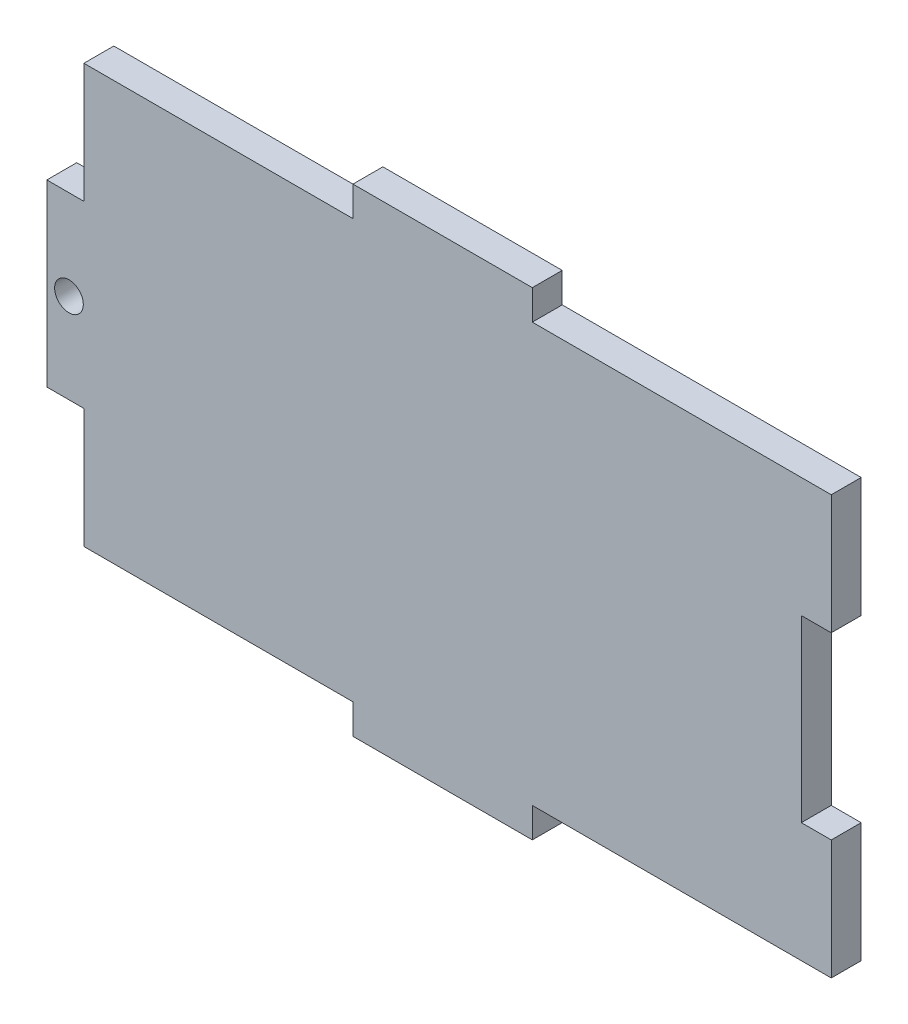
ISO-10303-21;
HEADER;
FILE_DESCRIPTION(('STEP AP214'),'2;1');
FILE_NAME('part.step','',(''),(''),'','','');
FILE_SCHEMA(('AUTOMOTIVE_DESIGN { 1 0 10303 214 1 1 1 1 }'));
ENDSEC;
DATA;
#1=APPLICATION_CONTEXT('core data for automotive mechanical design processes');
#2=APPLICATION_PROTOCOL_DEFINITION('international standard','automotive_design',2000,#1);
#3=PRODUCT_CONTEXT('',#1,'mechanical');
#4=PRODUCT('Part','Part','',(#3));
#5=PRODUCT_RELATED_PRODUCT_CATEGORY('part','',(#4));
#6=PRODUCT_DEFINITION_FORMATION('','',#4);
#7=PRODUCT_DEFINITION_CONTEXT('part definition',#1,'design');
#8=PRODUCT_DEFINITION('design','',#6,#7);
#9=PRODUCT_DEFINITION_SHAPE('','',#8);
#10=(LENGTH_UNIT() NAMED_UNIT(*) SI_UNIT(.MILLI.,.METRE.));
#11=(NAMED_UNIT(*) PLANE_ANGLE_UNIT() SI_UNIT($,.RADIAN.));
#12=(NAMED_UNIT(*) SI_UNIT($,.STERADIAN.) SOLID_ANGLE_UNIT());
#13=UNCERTAINTY_MEASURE_WITH_UNIT(LENGTH_MEASURE(1.E-05),#10,'distance_accuracy_value','');
#14=(GEOMETRIC_REPRESENTATION_CONTEXT(3) GLOBAL_UNCERTAINTY_ASSIGNED_CONTEXT((#13)) GLOBAL_UNIT_ASSIGNED_CONTEXT((#10,
#11,#12)) REPRESENTATION_CONTEXT('',''));
#15=CARTESIAN_POINT('',(0.,0.,0.));
#16=DIRECTION('',(0.,0.,1.));
#17=DIRECTION('',(1.,0.,0.));
#18=AXIS2_PLACEMENT_3D('',#15,#16,#17);
#19=CARTESIAN_POINT('',(79.375,0.,3.175));
#20=DIRECTION('',(-1.,0.,0.));
#21=DIRECTION('',(0.,-1.,0.));
#22=AXIS2_PLACEMENT_3D('',#19,#20,#21);
#23=PLANE('',#22);
#24=DIRECTION('',(0.,1.,0.));
#25=VECTOR('',#24,1.);
#26=CARTESIAN_POINT('',(79.375,0.,0.));
#27=LINE('',#26,#25);
#28=CARTESIAN_POINT('',(79.375,0.,0.));
#29=VERTEX_POINT('',#28);
#30=CARTESIAN_POINT('',(79.375,12.7,0.));
#31=VERTEX_POINT('',#30);
#32=EDGE_CURVE('E317',#29,#31,#27,.T.);
#33=ORIENTED_EDGE('',*,*,#32,.T.);
#34=DIRECTION('',(0.,0.,1.));
#35=VECTOR('',#34,1.);
#36=CARTESIAN_POINT('',(79.375,12.7,0.));
#37=LINE('',#36,#35);
#38=CARTESIAN_POINT('',(79.375,12.7,3.175));
#39=VERTEX_POINT('',#38);
#40=EDGE_CURVE('E220',#31,#39,#37,.T.);
#41=ORIENTED_EDGE('',*,*,#40,.T.);
#42=DIRECTION('',(0.,1.,0.));
#43=VECTOR('',#42,1.);
#44=CARTESIAN_POINT('',(79.375,0.,3.175));
#45=LINE('',#44,#43);
#46=CARTESIAN_POINT('',(79.375,0.,3.175));
#47=VERTEX_POINT('',#46);
#48=EDGE_CURVE('E379',#47,#39,#45,.T.);
#49=ORIENTED_EDGE('',*,*,#48,.F.);
#50=DIRECTION('',(0.,0.,-1.));
#51=VECTOR('',#50,1.);
#52=CARTESIAN_POINT('',(79.375,0.,3.175));
#53=LINE('',#52,#51);
#54=EDGE_CURVE('E42',#47,#29,#53,.T.);
#55=ORIENTED_EDGE('',*,*,#54,.T.);
#56=EDGE_LOOP('',(#33,#41,#49,#55));
#57=FACE_BOUND('',#56,.T.);
#58=ADVANCED_FACE('F33',(#57),#23,.F.);
#59=CARTESIAN_POINT('',(0.,0.,3.175));
#60=DIRECTION('',(0.,1.,0.));
#61=DIRECTION('',(0.,0.,1.));
#62=AXIS2_PLACEMENT_3D('',#59,#60,#61);
#63=PLANE('',#62);
#64=DIRECTION('',(0.,0.,1.));
#65=VECTOR('',#64,1.);
#66=CARTESIAN_POINT('',(47.625,0.,0.));
#67=LINE('',#66,#65);
#68=CARTESIAN_POINT('',(47.625,0.,0.));
#69=VERTEX_POINT('',#68);
#70=CARTESIAN_POINT('',(47.625,0.,3.175));
#71=VERTEX_POINT('',#70);
#72=EDGE_CURVE('E242',#69,#71,#67,.T.);
#73=ORIENTED_EDGE('',*,*,#72,.F.);
#74=DIRECTION('',(1.,0.,0.));
#75=VECTOR('',#74,1.);
#76=CARTESIAN_POINT('',(0.,0.,0.));
#77=LINE('',#76,#75);
#78=EDGE_CURVE('E310',#69,#29,#77,.T.);
#79=ORIENTED_EDGE('',*,*,#78,.T.);
#80=ORIENTED_EDGE('',*,*,#54,.F.);
#81=DIRECTION('',(1.,0.,0.));
#82=VECTOR('',#81,1.);
#83=CARTESIAN_POINT('',(0.,0.,3.175));
#84=LINE('',#83,#82);
#85=EDGE_CURVE('E360',#71,#47,#84,.T.);
#86=ORIENTED_EDGE('',*,*,#85,.F.);
#87=EDGE_LOOP('',(#73,#79,#80,#86));
#88=FACE_BOUND('',#87,.T.);
#89=ADVANCED_FACE('F398',(#88),#63,.F.);
#90=CARTESIAN_POINT('',(0.,44.45,3.175));
#91=DIRECTION('',(0.,-1.,0.));
#92=DIRECTION('',(0.,0.,-1.));
#93=AXIS2_PLACEMENT_3D('',#90,#91,#92);
#94=PLANE('',#93);
#95=DIRECTION('',(0.,0.,1.));
#96=VECTOR('',#95,1.);
#97=CARTESIAN_POINT('',(28.575,44.45,0.));
#98=LINE('',#97,#96);
#99=CARTESIAN_POINT('',(28.575,44.45,0.));
#100=VERTEX_POINT('',#99);
#101=CARTESIAN_POINT('',(28.575,44.45,3.175));
#102=VERTEX_POINT('',#101);
#103=EDGE_CURVE('E270',#100,#102,#98,.T.);
#104=ORIENTED_EDGE('',*,*,#103,.F.);
#105=DIRECTION('',(-1.,0.,0.));
#106=VECTOR('',#105,1.);
#107=CARTESIAN_POINT('',(0.,44.45,0.));
#108=LINE('',#107,#106);
#109=CARTESIAN_POINT('',(0.,44.45,0.));
#110=VERTEX_POINT('',#109);
#111=EDGE_CURVE('E321',#100,#110,#108,.T.);
#112=ORIENTED_EDGE('',*,*,#111,.T.);
#113=DIRECTION('',(0.,0.,-1.));
#114=VECTOR('',#113,1.);
#115=CARTESIAN_POINT('',(0.,44.45,3.175));
#116=LINE('',#115,#114);
#117=CARTESIAN_POINT('',(0.,44.45,3.175));
#118=VERTEX_POINT('',#117);
#119=EDGE_CURVE('E324',#118,#110,#116,.T.);
#120=ORIENTED_EDGE('',*,*,#119,.F.);
#121=DIRECTION('',(-1.,0.,0.));
#122=VECTOR('',#121,1.);
#123=CARTESIAN_POINT('',(0.,44.45,3.175));
#124=LINE('',#123,#122);
#125=EDGE_CURVE('E377',#102,#118,#124,.T.);
#126=ORIENTED_EDGE('',*,*,#125,.F.);
#127=EDGE_LOOP('',(#104,#112,#120,#126));
#128=FACE_BOUND('',#127,.T.);
#129=ADVANCED_FACE('F429',(#128),#94,.F.);
#130=CARTESIAN_POINT('',(0.,0.,3.175));
#131=DIRECTION('',(1.,0.,0.));
#132=DIRECTION('',(0.,1.,0.));
#133=AXIS2_PLACEMENT_3D('',#130,#131,#132);
#134=PLANE('',#133);
#135=DIRECTION('',(0.,0.,1.));
#136=VECTOR('',#135,1.);
#137=CARTESIAN_POINT('',(0.,12.7,0.));
#138=LINE('',#137,#136);
#139=CARTESIAN_POINT('',(0.,12.7,0.));
#140=VERTEX_POINT('',#139);
#141=CARTESIAN_POINT('',(0.,12.7,3.175));
#142=VERTEX_POINT('',#141);
#143=EDGE_CURVE('E341',#140,#142,#138,.T.);
#144=ORIENTED_EDGE('',*,*,#143,.F.);
#145=DIRECTION('',(0.,-1.,0.));
#146=VECTOR('',#145,1.);
#147=CARTESIAN_POINT('',(0.,0.,0.));
#148=LINE('',#147,#146);
#149=CARTESIAN_POINT('',(0.,0.,0.));
#150=VERTEX_POINT('',#149);
#151=EDGE_CURVE('E343',#140,#150,#148,.T.);
#152=ORIENTED_EDGE('',*,*,#151,.T.);
#153=DIRECTION('',(0.,0.,-1.));
#154=VECTOR('',#153,1.);
#155=CARTESIAN_POINT('',(0.,0.,3.175));
#156=LINE('',#155,#154);
#157=CARTESIAN_POINT('',(0.,0.,3.175));
#158=VERTEX_POINT('',#157);
#159=EDGE_CURVE('E11',#158,#150,#156,.T.);
#160=ORIENTED_EDGE('',*,*,#159,.F.);
#161=DIRECTION('',(0.,-1.,0.));
#162=VECTOR('',#161,1.);
#163=CARTESIAN_POINT('',(0.,0.,3.175));
#164=LINE('',#163,#162);
#165=EDGE_CURVE('E333',#142,#158,#164,.T.);
#166=ORIENTED_EDGE('',*,*,#165,.F.);
#167=EDGE_LOOP('',(#144,#152,#160,#166));
#168=FACE_BOUND('',#167,.T.);
#169=ADVANCED_FACE('F442',(#168),#134,.F.);
#170=CARTESIAN_POINT('',(0.,31.75,0.));
#171=VERTEX_POINT('',#170);
#172=EDGE_CURVE('E362',#110,#171,#148,.T.);
#173=ORIENTED_EDGE('',*,*,#172,.T.);
#174=DIRECTION('',(0.,0.,1.));
#175=VECTOR('',#174,1.);
#176=CARTESIAN_POINT('',(0.,31.75,0.));
#177=LINE('',#176,#175);
#178=CARTESIAN_POINT('',(0.,31.75,3.175));
#179=VERTEX_POINT('',#178);
#180=EDGE_CURVE('E178',#171,#179,#177,.T.);
#181=ORIENTED_EDGE('',*,*,#180,.T.);
#182=EDGE_CURVE('E357',#118,#179,#164,.T.);
#183=ORIENTED_EDGE('',*,*,#182,.F.);
#184=ORIENTED_EDGE('',*,*,#119,.T.);
#185=EDGE_LOOP('',(#173,#181,#183,#184));
#186=FACE_BOUND('',#185,.T.);
#187=ADVANCED_FACE('F35',(#186),#134,.F.);
#188=CARTESIAN_POINT('',(28.575,0.,0.));
#189=VERTEX_POINT('',#188);
#190=EDGE_CURVE('E305',#150,#189,#77,.T.);
#191=ORIENTED_EDGE('',*,*,#190,.T.);
#192=DIRECTION('',(0.,0.,1.));
#193=VECTOR('',#192,1.);
#194=CARTESIAN_POINT('',(28.575,0.,0.));
#195=LINE('',#194,#193);
#196=CARTESIAN_POINT('',(28.575,0.,3.175));
#197=VERTEX_POINT('',#196);
#198=EDGE_CURVE('E249',#189,#197,#195,.T.);
#199=ORIENTED_EDGE('',*,*,#198,.T.);
#200=EDGE_CURVE('E389',#158,#197,#84,.T.);
#201=ORIENTED_EDGE('',*,*,#200,.F.);
#202=ORIENTED_EDGE('',*,*,#159,.T.);
#203=EDGE_LOOP('',(#191,#199,#201,#202));
#204=FACE_BOUND('',#203,.T.);
#205=ADVANCED_FACE('F430',(#204),#63,.F.);
#206=CARTESIAN_POINT('',(79.375,31.75,3.175));
#207=VERTEX_POINT('',#206);
#208=CARTESIAN_POINT('',(79.375,44.45,3.175));
#209=VERTEX_POINT('',#208);
#210=EDGE_CURVE('E385',#207,#209,#45,.T.);
#211=ORIENTED_EDGE('',*,*,#210,.F.);
#212=DIRECTION('',(0.,0.,1.));
#213=VECTOR('',#212,1.);
#214=CARTESIAN_POINT('',(79.375,31.75,0.));
#215=LINE('',#214,#213);
#216=CARTESIAN_POINT('',(79.375,31.75,0.));
#217=VERTEX_POINT('',#216);
#218=EDGE_CURVE('E213',#217,#207,#215,.T.);
#219=ORIENTED_EDGE('',*,*,#218,.F.);
#220=CARTESIAN_POINT('',(79.375,44.45,0.));
#221=VERTEX_POINT('',#220);
#222=EDGE_CURVE('E309',#217,#221,#27,.T.);
#223=ORIENTED_EDGE('',*,*,#222,.T.);
#224=DIRECTION('',(0.,0.,-1.));
#225=VECTOR('',#224,1.);
#226=CARTESIAN_POINT('',(79.375,44.45,3.175));
#227=LINE('',#226,#225);
#228=EDGE_CURVE('E365',#209,#221,#227,.T.);
#229=ORIENTED_EDGE('',*,*,#228,.F.);
#230=EDGE_LOOP('',(#211,#219,#223,#229));
#231=FACE_BOUND('',#230,.T.);
#232=ADVANCED_FACE('F412',(#231),#23,.F.);
#233=CARTESIAN_POINT('',(47.625,44.45,0.));
#234=VERTEX_POINT('',#233);
#235=EDGE_CURVE('E330',#221,#234,#108,.T.);
#236=ORIENTED_EDGE('',*,*,#235,.T.);
#237=DIRECTION('',(0.,0.,1.));
#238=VECTOR('',#237,1.);
#239=CARTESIAN_POINT('',(47.625,44.45,0.));
#240=LINE('',#239,#238);
#241=CARTESIAN_POINT('',(47.625,44.45,3.175));
#242=VERTEX_POINT('',#241);
#243=EDGE_CURVE('E282',#234,#242,#240,.T.);
#244=ORIENTED_EDGE('',*,*,#243,.T.);
#245=EDGE_CURVE('E372',#209,#242,#124,.T.);
#246=ORIENTED_EDGE('',*,*,#245,.F.);
#247=ORIENTED_EDGE('',*,*,#228,.T.);
#248=EDGE_LOOP('',(#236,#244,#246,#247));
#249=FACE_BOUND('',#248,.T.);
#250=ADVANCED_FACE('F433',(#249),#94,.F.);
#251=CARTESIAN_POINT('',(0.,0.,3.175));
#252=DIRECTION('',(0.,0.,-1.));
#253=DIRECTION('',(-1.,0.,0.));
#254=AXIS2_PLACEMENT_3D('',#251,#252,#253);
#255=PLANE('',#254);
#256=CARTESIAN_POINT('',(-1.5875,22.225,3.175));
#257=DIRECTION('',(0.,0.,1.));
#258=DIRECTION('',(1.,0.,0.));
#259=AXIS2_PLACEMENT_3D('',#256,#257,#258);
#260=CIRCLE('',#259,1.524);
#261=CARTESIAN_POINT('',(-0.0634999999999982,22.225,3.175));
#262=VERTEX_POINT('',#261);
#263=EDGE_CURVE('E202',#262,#262,#260,.T.);
#264=ORIENTED_EDGE('',*,*,#263,.F.);
#265=EDGE_LOOP('',(#264));
#266=FACE_BOUND('',#265,.T.);
#267=ORIENTED_EDGE('',*,*,#48,.T.);
#268=DIRECTION('',(1.,0.,0.));
#269=VECTOR('',#268,1.);
#270=CARTESIAN_POINT('',(79.375,12.7,3.175));
#271=LINE('',#270,#269);
#272=CARTESIAN_POINT('',(76.2,12.7,3.175));
#273=VERTEX_POINT('',#272);
#274=EDGE_CURVE('E209',#273,#39,#271,.T.);
#275=ORIENTED_EDGE('',*,*,#274,.F.);
#276=DIRECTION('',(0.,-1.,0.));
#277=VECTOR('',#276,1.);
#278=CARTESIAN_POINT('',(76.2,12.7,3.175));
#279=LINE('',#278,#277);
#280=CARTESIAN_POINT('',(76.2,31.75,3.175));
#281=VERTEX_POINT('',#280);
#282=EDGE_CURVE('E216',#281,#273,#279,.T.);
#283=ORIENTED_EDGE('',*,*,#282,.F.);
#284=DIRECTION('',(-1.,0.,0.));
#285=VECTOR('',#284,1.);
#286=CARTESIAN_POINT('',(79.375,31.75,3.175));
#287=LINE('',#286,#285);
#288=EDGE_CURVE('E204',#207,#281,#287,.T.);
#289=ORIENTED_EDGE('',*,*,#288,.F.);
#290=ORIENTED_EDGE('',*,*,#210,.T.);
#291=ORIENTED_EDGE('',*,*,#245,.T.);
#292=DIRECTION('',(0.,1.,0.));
#293=VECTOR('',#292,1.);
#294=CARTESIAN_POINT('',(47.625,44.45,3.175));
#295=LINE('',#294,#293);
#296=CARTESIAN_POINT('',(47.625,47.625,3.175));
#297=VERTEX_POINT('',#296);
#298=EDGE_CURVE('E276',#242,#297,#295,.T.);
#299=ORIENTED_EDGE('',*,*,#298,.T.);
#300=DIRECTION('',(-1.,0.,0.));
#301=VECTOR('',#300,1.);
#302=CARTESIAN_POINT('',(28.575,47.625,3.175));
#303=LINE('',#302,#301);
#304=CARTESIAN_POINT('',(28.575,47.625,3.175));
#305=VERTEX_POINT('',#304);
#306=EDGE_CURVE('E272',#297,#305,#303,.T.);
#307=ORIENTED_EDGE('',*,*,#306,.T.);
#308=DIRECTION('',(0.,-1.,0.));
#309=VECTOR('',#308,1.);
#310=CARTESIAN_POINT('',(28.575,44.45,3.175));
#311=LINE('',#310,#309);
#312=EDGE_CURVE('E245',#305,#102,#311,.T.);
#313=ORIENTED_EDGE('',*,*,#312,.T.);
#314=ORIENTED_EDGE('',*,*,#125,.T.);
#315=ORIENTED_EDGE('',*,*,#182,.T.);
#316=DIRECTION('',(-1.,0.,0.));
#317=VECTOR('',#316,1.);
#318=CARTESIAN_POINT('',(0.,31.75,3.175));
#319=LINE('',#318,#317);
#320=CARTESIAN_POINT('',(-3.937,31.75,3.175));
#321=VERTEX_POINT('',#320);
#322=EDGE_CURVE('E279',#179,#321,#319,.T.);
#323=ORIENTED_EDGE('',*,*,#322,.T.);
#324=DIRECTION('',(0.,-1.,0.));
#325=VECTOR('',#324,1.);
#326=CARTESIAN_POINT('',(-3.937,31.75,3.175));
#327=LINE('',#326,#325);
#328=CARTESIAN_POINT('',(-3.937,12.7,3.175));
#329=VERTEX_POINT('',#328);
#330=EDGE_CURVE('E192',#321,#329,#327,.T.);
#331=ORIENTED_EDGE('',*,*,#330,.T.);
#332=DIRECTION('',(1.,0.,0.));
#333=VECTOR('',#332,1.);
#334=CARTESIAN_POINT('',(0.,12.7,3.175));
#335=LINE('',#334,#333);
#336=EDGE_CURVE('E184',#329,#142,#335,.T.);
#337=ORIENTED_EDGE('',*,*,#336,.T.);
#338=ORIENTED_EDGE('',*,*,#165,.T.);
#339=ORIENTED_EDGE('',*,*,#200,.T.);
#340=DIRECTION('',(0.,-1.,0.));
#341=VECTOR('',#340,1.);
#342=CARTESIAN_POINT('',(28.575,0.,3.175));
#343=LINE('',#342,#341);
#344=CARTESIAN_POINT('',(28.575,-3.17499999999998,3.175));
#345=VERTEX_POINT('',#344);
#346=EDGE_CURVE('E58',#197,#345,#343,.T.);
#347=ORIENTED_EDGE('',*,*,#346,.T.);
#348=DIRECTION('',(1.,0.,0.));
#349=VECTOR('',#348,1.);
#350=CARTESIAN_POINT('',(28.575,-3.17499999999998,3.175));
#351=LINE('',#350,#349);
#352=CARTESIAN_POINT('',(47.625,-3.17499999999999,3.175));
#353=VERTEX_POINT('',#352);
#354=EDGE_CURVE('E233',#345,#353,#351,.T.);
#355=ORIENTED_EDGE('',*,*,#354,.T.);
#356=DIRECTION('',(0.,1.,0.));
#357=VECTOR('',#356,1.);
#358=CARTESIAN_POINT('',(47.625,0.,3.175));
#359=LINE('',#358,#357);
#360=EDGE_CURVE('E236',#353,#71,#359,.T.);
#361=ORIENTED_EDGE('',*,*,#360,.T.);
#362=ORIENTED_EDGE('',*,*,#85,.T.);
#363=EDGE_LOOP('',(#267,#275,#283,#289,#290,#291,#299,#307,#313,#314,#315,#323,#331,#337,#338,
#339,#347,#355,#361,#362));
#364=FACE_BOUND('',#363,.T.);
#365=ADVANCED_FACE('F393',(#266,#364),#255,.F.);
#366=CARTESIAN_POINT('',(0.,0.,0.));
#367=DIRECTION('',(0.,0.,-1.));
#368=DIRECTION('',(-1.,0.,0.));
#369=AXIS2_PLACEMENT_3D('',#366,#367,#368);
#370=PLANE('',#369);
#371=CARTESIAN_POINT('',(-1.5875,22.225,0.));
#372=DIRECTION('',(0.,0.,-1.));
#373=DIRECTION('',(-1.,0.,0.));
#374=AXIS2_PLACEMENT_3D('',#371,#372,#373);
#375=CIRCLE('',#374,1.524);
#376=CARTESIAN_POINT('',(-3.1115,22.225,0.));
#377=VERTEX_POINT('',#376);
#378=EDGE_CURVE('E37',#377,#377,#375,.T.);
#379=ORIENTED_EDGE('',*,*,#378,.F.);
#380=EDGE_LOOP('',(#379));
#381=FACE_BOUND('',#380,.T.);
#382=DIRECTION('',(1.,0.,0.));
#383=VECTOR('',#382,1.);
#384=CARTESIAN_POINT('',(79.375,12.7,0.));
#385=LINE('',#384,#383);
#386=CARTESIAN_POINT('',(76.2,12.7,0.));
#387=VERTEX_POINT('',#386);
#388=EDGE_CURVE('E211',#387,#31,#385,.T.);
#389=ORIENTED_EDGE('',*,*,#388,.T.);
#390=ORIENTED_EDGE('',*,*,#32,.F.);
#391=ORIENTED_EDGE('',*,*,#78,.F.);
#392=DIRECTION('',(0.,1.,0.));
#393=VECTOR('',#392,1.);
#394=CARTESIAN_POINT('',(47.625,0.,0.));
#395=LINE('',#394,#393);
#396=CARTESIAN_POINT('',(47.625,-3.17499999999999,0.));
#397=VERTEX_POINT('',#396);
#398=EDGE_CURVE('E231',#397,#69,#395,.T.);
#399=ORIENTED_EDGE('',*,*,#398,.F.);
#400=DIRECTION('',(1.,0.,0.));
#401=VECTOR('',#400,1.);
#402=CARTESIAN_POINT('',(28.575,-3.17499999999998,0.));
#403=LINE('',#402,#401);
#404=CARTESIAN_POINT('',(28.575,-3.17499999999998,0.));
#405=VERTEX_POINT('',#404);
#406=EDGE_CURVE('E228',#405,#397,#403,.T.);
#407=ORIENTED_EDGE('',*,*,#406,.F.);
#408=DIRECTION('',(0.,-1.,0.));
#409=VECTOR('',#408,1.);
#410=CARTESIAN_POINT('',(28.575,0.,0.));
#411=LINE('',#410,#409);
#412=EDGE_CURVE('E232',#189,#405,#411,.T.);
#413=ORIENTED_EDGE('',*,*,#412,.F.);
#414=ORIENTED_EDGE('',*,*,#190,.F.);
#415=ORIENTED_EDGE('',*,*,#151,.F.);
#416=DIRECTION('',(1.,0.,0.));
#417=VECTOR('',#416,1.);
#418=CARTESIAN_POINT('',(0.,12.7,0.));
#419=LINE('',#418,#417);
#420=CARTESIAN_POINT('',(-3.937,12.7,0.));
#421=VERTEX_POINT('',#420);
#422=EDGE_CURVE('E183',#421,#140,#419,.T.);
#423=ORIENTED_EDGE('',*,*,#422,.F.);
#424=DIRECTION('',(0.,-1.,0.));
#425=VECTOR('',#424,1.);
#426=CARTESIAN_POINT('',(-3.937,31.75,0.));
#427=LINE('',#426,#425);
#428=CARTESIAN_POINT('',(-3.937,31.75,0.));
#429=VERTEX_POINT('',#428);
#430=EDGE_CURVE('E190',#429,#421,#427,.T.);
#431=ORIENTED_EDGE('',*,*,#430,.F.);
#432=DIRECTION('',(-1.,0.,0.));
#433=VECTOR('',#432,1.);
#434=CARTESIAN_POINT('',(0.,31.75,0.));
#435=LINE('',#434,#433);
#436=EDGE_CURVE('E172',#171,#429,#435,.T.);
#437=ORIENTED_EDGE('',*,*,#436,.F.);
#438=ORIENTED_EDGE('',*,*,#172,.F.);
#439=ORIENTED_EDGE('',*,*,#111,.F.);
#440=DIRECTION('',(0.,-1.,0.));
#441=VECTOR('',#440,1.);
#442=CARTESIAN_POINT('',(28.575,44.45,0.));
#443=LINE('',#442,#441);
#444=CARTESIAN_POINT('',(28.575,47.625,0.));
#445=VERTEX_POINT('',#444);
#446=EDGE_CURVE('E275',#445,#100,#443,.T.);
#447=ORIENTED_EDGE('',*,*,#446,.F.);
#448=DIRECTION('',(-1.,0.,0.));
#449=VECTOR('',#448,1.);
#450=CARTESIAN_POINT('',(28.575,47.625,0.));
#451=LINE('',#450,#449);
#452=CARTESIAN_POINT('',(47.625,47.625,0.));
#453=VERTEX_POINT('',#452);
#454=EDGE_CURVE('E267',#453,#445,#451,.T.);
#455=ORIENTED_EDGE('',*,*,#454,.F.);
#456=DIRECTION('',(0.,1.,0.));
#457=VECTOR('',#456,1.);
#458=CARTESIAN_POINT('',(47.625,44.45,0.));
#459=LINE('',#458,#457);
#460=EDGE_CURVE('E271',#234,#453,#459,.T.);
#461=ORIENTED_EDGE('',*,*,#460,.F.);
#462=ORIENTED_EDGE('',*,*,#235,.F.);
#463=ORIENTED_EDGE('',*,*,#222,.F.);
#464=DIRECTION('',(-1.,0.,0.));
#465=VECTOR('',#464,1.);
#466=CARTESIAN_POINT('',(79.375,31.75,0.));
#467=LINE('',#466,#465);
#468=CARTESIAN_POINT('',(76.2,31.75,0.));
#469=VERTEX_POINT('',#468);
#470=EDGE_CURVE('E206',#217,#469,#467,.T.);
#471=ORIENTED_EDGE('',*,*,#470,.T.);
#472=DIRECTION('',(0.,-1.,0.));
#473=VECTOR('',#472,1.);
#474=CARTESIAN_POINT('',(76.2,12.7,0.));
#475=LINE('',#474,#473);
#476=EDGE_CURVE('E50',#469,#387,#475,.T.);
#477=ORIENTED_EDGE('',*,*,#476,.T.);
#478=EDGE_LOOP('',(#389,#390,#391,#399,#407,#413,#414,#415,#423,#431,#437,#438,#439,#447,#455,
#461,#462,#463,#471,#477));
#479=FACE_BOUND('',#478,.T.);
#480=ADVANCED_FACE('F196',(#381,#479),#370,.T.);
#481=CARTESIAN_POINT('',(0.,12.7,0.));
#482=DIRECTION('',(0.,-1.,0.));
#483=DIRECTION('',(0.,0.,-1.));
#484=AXIS2_PLACEMENT_3D('',#481,#482,#483);
#485=PLANE('',#484);
#486=ORIENTED_EDGE('',*,*,#336,.F.);
#487=DIRECTION('',(0.,0.,1.));
#488=VECTOR('',#487,1.);
#489=CARTESIAN_POINT('',(-3.937,12.7,0.));
#490=LINE('',#489,#488);
#491=EDGE_CURVE('E193',#421,#329,#490,.T.);
#492=ORIENTED_EDGE('',*,*,#491,.F.);
#493=ORIENTED_EDGE('',*,*,#422,.T.);
#494=ORIENTED_EDGE('',*,*,#143,.T.);
#495=EDGE_LOOP('',(#486,#492,#493,#494));
#496=FACE_BOUND('',#495,.T.);
#497=ADVANCED_FACE('F471',(#496),#485,.T.);
#498=CARTESIAN_POINT('',(0.,31.75,0.));
#499=DIRECTION('',(0.,1.,0.));
#500=DIRECTION('',(0.,0.,1.));
#501=AXIS2_PLACEMENT_3D('',#498,#499,#500);
#502=PLANE('',#501);
#503=ORIENTED_EDGE('',*,*,#322,.F.);
#504=ORIENTED_EDGE('',*,*,#180,.F.);
#505=ORIENTED_EDGE('',*,*,#436,.T.);
#506=DIRECTION('',(0.,0.,1.));
#507=VECTOR('',#506,1.);
#508=CARTESIAN_POINT('',(-3.937,31.75,0.));
#509=LINE('',#508,#507);
#510=EDGE_CURVE('E175',#429,#321,#509,.T.);
#511=ORIENTED_EDGE('',*,*,#510,.T.);
#512=EDGE_LOOP('',(#503,#504,#505,#511));
#513=FACE_BOUND('',#512,.T.);
#514=ADVANCED_FACE('F174',(#513),#502,.T.);
#515=CARTESIAN_POINT('',(28.575,44.45,0.));
#516=DIRECTION('',(-1.,0.,0.));
#517=DIRECTION('',(0.,0.,1.));
#518=AXIS2_PLACEMENT_3D('',#515,#516,#517);
#519=PLANE('',#518);
#520=ORIENTED_EDGE('',*,*,#312,.F.);
#521=DIRECTION('',(0.,0.,1.));
#522=VECTOR('',#521,1.);
#523=CARTESIAN_POINT('',(28.575,47.625,0.));
#524=LINE('',#523,#522);
#525=EDGE_CURVE('E277',#445,#305,#524,.T.);
#526=ORIENTED_EDGE('',*,*,#525,.F.);
#527=ORIENTED_EDGE('',*,*,#446,.T.);
#528=ORIENTED_EDGE('',*,*,#103,.T.);
#529=EDGE_LOOP('',(#520,#526,#527,#528));
#530=FACE_BOUND('',#529,.T.);
#531=ADVANCED_FACE('F463',(#530),#519,.T.);
#532=CARTESIAN_POINT('',(28.575,47.625,0.));
#533=DIRECTION('',(0.,1.,0.));
#534=DIRECTION('',(0.,0.,1.));
#535=AXIS2_PLACEMENT_3D('',#532,#533,#534);
#536=PLANE('',#535);
#537=ORIENTED_EDGE('',*,*,#306,.F.);
#538=DIRECTION('',(0.,0.,1.));
#539=VECTOR('',#538,1.);
#540=CARTESIAN_POINT('',(47.625,47.625,0.));
#541=LINE('',#540,#539);
#542=EDGE_CURVE('E280',#453,#297,#541,.T.);
#543=ORIENTED_EDGE('',*,*,#542,.F.);
#544=ORIENTED_EDGE('',*,*,#454,.T.);
#545=ORIENTED_EDGE('',*,*,#525,.T.);
#546=EDGE_LOOP('',(#537,#543,#544,#545));
#547=FACE_BOUND('',#546,.T.);
#548=ADVANCED_FACE('F459',(#547),#536,.T.);
#549=CARTESIAN_POINT('',(47.625,44.45,0.));
#550=DIRECTION('',(1.,0.,0.));
#551=DIRECTION('',(0.,1.,0.));
#552=AXIS2_PLACEMENT_3D('',#549,#550,#551);
#553=PLANE('',#552);
#554=ORIENTED_EDGE('',*,*,#298,.F.);
#555=ORIENTED_EDGE('',*,*,#243,.F.);
#556=ORIENTED_EDGE('',*,*,#460,.T.);
#557=ORIENTED_EDGE('',*,*,#542,.T.);
#558=EDGE_LOOP('',(#554,#555,#556,#557));
#559=FACE_BOUND('',#558,.T.);
#560=ADVANCED_FACE('F462',(#559),#553,.T.);
#561=CARTESIAN_POINT('',(47.625,0.,0.));
#562=DIRECTION('',(1.,0.,0.));
#563=DIRECTION('',(0.,1.,0.));
#564=AXIS2_PLACEMENT_3D('',#561,#562,#563);
#565=PLANE('',#564);
#566=ORIENTED_EDGE('',*,*,#360,.F.);
#567=DIRECTION('',(0.,0.,1.));
#568=VECTOR('',#567,1.);
#569=CARTESIAN_POINT('',(47.625,-3.17499999999999,0.));
#570=LINE('',#569,#568);
#571=EDGE_CURVE('E239',#397,#353,#570,.T.);
#572=ORIENTED_EDGE('',*,*,#571,.F.);
#573=ORIENTED_EDGE('',*,*,#398,.T.);
#574=ORIENTED_EDGE('',*,*,#72,.T.);
#575=EDGE_LOOP('',(#566,#572,#573,#574));
#576=FACE_BOUND('',#575,.T.);
#577=ADVANCED_FACE('F455',(#576),#565,.T.);
#578=CARTESIAN_POINT('',(28.575,-3.17499999999998,0.));
#579=DIRECTION('',(0.,-1.,0.));
#580=DIRECTION('',(1.,0.,0.));
#581=AXIS2_PLACEMENT_3D('',#578,#579,#580);
#582=PLANE('',#581);
#583=ORIENTED_EDGE('',*,*,#354,.F.);
#584=DIRECTION('',(0.,0.,1.));
#585=VECTOR('',#584,1.);
#586=CARTESIAN_POINT('',(28.575,-3.17499999999998,0.));
#587=LINE('',#586,#585);
#588=EDGE_CURVE('E262',#405,#345,#587,.T.);
#589=ORIENTED_EDGE('',*,*,#588,.F.);
#590=ORIENTED_EDGE('',*,*,#406,.T.);
#591=ORIENTED_EDGE('',*,*,#571,.T.);
#592=EDGE_LOOP('',(#583,#589,#590,#591));
#593=FACE_BOUND('',#592,.T.);
#594=ADVANCED_FACE('F449',(#593),#582,.T.);
#595=CARTESIAN_POINT('',(28.575,0.,0.));
#596=DIRECTION('',(-1.,0.,0.));
#597=DIRECTION('',(0.,0.,1.));
#598=AXIS2_PLACEMENT_3D('',#595,#596,#597);
#599=PLANE('',#598);
#600=ORIENTED_EDGE('',*,*,#346,.F.);
#601=ORIENTED_EDGE('',*,*,#198,.F.);
#602=ORIENTED_EDGE('',*,*,#412,.T.);
#603=ORIENTED_EDGE('',*,*,#588,.T.);
#604=EDGE_LOOP('',(#600,#601,#602,#603));
#605=FACE_BOUND('',#604,.T.);
#606=ADVANCED_FACE('F422',(#605),#599,.T.);
#607=CARTESIAN_POINT('',(79.375,12.7,0.));
#608=DIRECTION('',(0.,-1.,0.));
#609=DIRECTION('',(1.,0.,0.));
#610=AXIS2_PLACEMENT_3D('',#607,#608,#609);
#611=PLANE('',#610);
#612=ORIENTED_EDGE('',*,*,#274,.T.);
#613=ORIENTED_EDGE('',*,*,#40,.F.);
#614=ORIENTED_EDGE('',*,*,#388,.F.);
#615=DIRECTION('',(0.,0.,1.));
#616=VECTOR('',#615,1.);
#617=CARTESIAN_POINT('',(76.2,12.7,0.));
#618=LINE('',#617,#616);
#619=EDGE_CURVE('E223',#387,#273,#618,.T.);
#620=ORIENTED_EDGE('',*,*,#619,.T.);
#621=EDGE_LOOP('',(#612,#613,#614,#620));
#622=FACE_BOUND('',#621,.T.);
#623=ADVANCED_FACE('F404',(#622),#611,.F.);
#624=CARTESIAN_POINT('',(76.2,12.7,0.));
#625=DIRECTION('',(-1.,0.,0.));
#626=DIRECTION('',(0.,-1.,0.));
#627=AXIS2_PLACEMENT_3D('',#624,#625,#626);
#628=PLANE('',#627);
#629=ORIENTED_EDGE('',*,*,#282,.T.);
#630=ORIENTED_EDGE('',*,*,#619,.F.);
#631=ORIENTED_EDGE('',*,*,#476,.F.);
#632=DIRECTION('',(0.,0.,1.));
#633=VECTOR('',#632,1.);
#634=CARTESIAN_POINT('',(76.2,31.75,0.));
#635=LINE('',#634,#633);
#636=EDGE_CURVE('E225',#469,#281,#635,.T.);
#637=ORIENTED_EDGE('',*,*,#636,.T.);
#638=EDGE_LOOP('',(#629,#630,#631,#637));
#639=FACE_BOUND('',#638,.T.);
#640=ADVANCED_FACE('F414',(#639),#628,.F.);
#641=CARTESIAN_POINT('',(79.375,31.75,0.));
#642=DIRECTION('',(0.,1.,0.));
#643=DIRECTION('',(0.,0.,1.));
#644=AXIS2_PLACEMENT_3D('',#641,#642,#643);
#645=PLANE('',#644);
#646=ORIENTED_EDGE('',*,*,#288,.T.);
#647=ORIENTED_EDGE('',*,*,#636,.F.);
#648=ORIENTED_EDGE('',*,*,#470,.F.);
#649=ORIENTED_EDGE('',*,*,#218,.T.);
#650=EDGE_LOOP('',(#646,#647,#648,#649));
#651=FACE_BOUND('',#650,.T.);
#652=ADVANCED_FACE('F408',(#651),#645,.F.);
#653=CARTESIAN_POINT('',(-3.937,31.75,0.));
#654=DIRECTION('',(-1.,0.,0.));
#655=DIRECTION('',(0.,-1.,0.));
#656=AXIS2_PLACEMENT_3D('',#653,#654,#655);
#657=PLANE('',#656);
#658=ORIENTED_EDGE('',*,*,#330,.F.);
#659=ORIENTED_EDGE('',*,*,#510,.F.);
#660=ORIENTED_EDGE('',*,*,#430,.T.);
#661=ORIENTED_EDGE('',*,*,#491,.T.);
#662=EDGE_LOOP('',(#658,#659,#660,#661));
#663=FACE_BOUND('',#662,.T.);
#664=ADVANCED_FACE('F188',(#663),#657,.T.);
#665=CARTESIAN_POINT('',(-1.5875,22.225,-5.00000000001367E-05));
#666=DIRECTION('',(0.,0.,1.));
#667=DIRECTION('',(1.,0.,0.));
#668=AXIS2_PLACEMENT_3D('',#665,#666,#667);
#669=CYLINDRICAL_SURFACE('',#668,1.524);
#670=ORIENTED_EDGE('',*,*,#378,.T.);
#671=EDGE_LOOP('',(#670));
#672=FACE_BOUND('',#671,.T.);
#673=ORIENTED_EDGE('',*,*,#263,.T.);
#674=EDGE_LOOP('',(#673));
#675=FACE_BOUND('',#674,.T.);
#676=ADVANCED_FACE('F490',(#672,#675),#669,.F.);
#677=CLOSED_SHELL('',(#58,#89,#129,#169,#187,#205,#232,#250,#365,#480,#497,#514,#531,#548,#560,
#577,#594,#606,#623,#640,#652,#664,#676));
#678=MANIFOLD_SOLID_BREP('B2',#677);
#679=ADVANCED_BREP_SHAPE_REPRESENTATION('',(#18,#678),#14);
#680=SHAPE_DEFINITION_REPRESENTATION(#9,#679);
ENDSEC;
END-ISO-10303-21;
